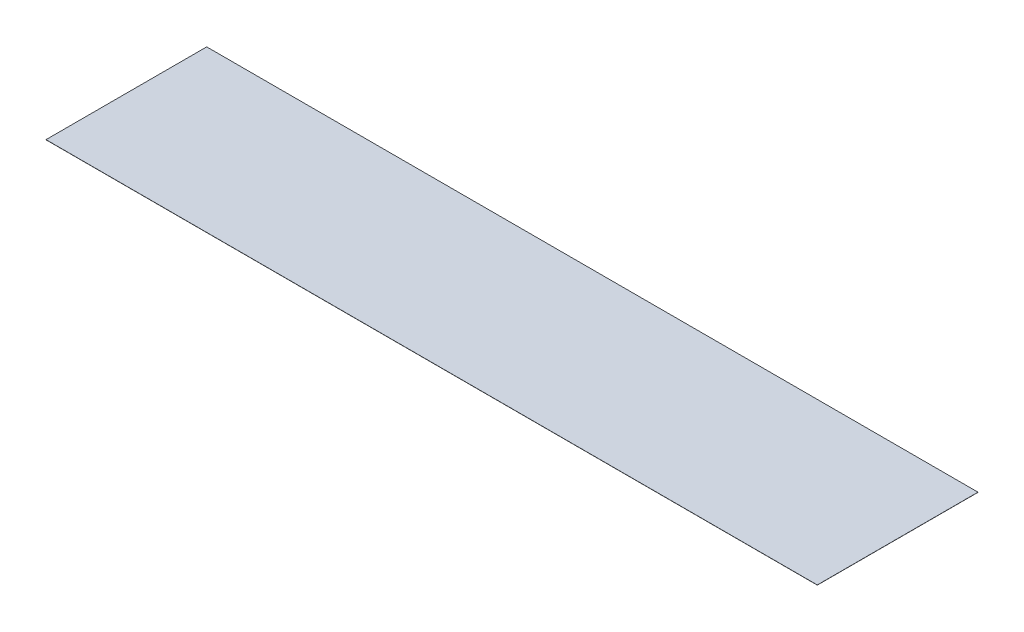
ISO-10303-21;
HEADER;
FILE_DESCRIPTION(('STEP AP214'),'2;1');
FILE_NAME('part.step','',(''),(''),'','','');
FILE_SCHEMA(('AUTOMOTIVE_DESIGN { 1 0 10303 214 1 1 1 1 }'));
ENDSEC;
DATA;
#1=APPLICATION_CONTEXT('core data for automotive mechanical design processes');
#2=APPLICATION_PROTOCOL_DEFINITION('international standard','automotive_design',2000,#1);
#3=PRODUCT_CONTEXT('',#1,'mechanical');
#4=PRODUCT('Part','Part','',(#3));
#5=PRODUCT_RELATED_PRODUCT_CATEGORY('part','',(#4));
#6=PRODUCT_DEFINITION_FORMATION('','',#4);
#7=PRODUCT_DEFINITION_CONTEXT('part definition',#1,'design');
#8=PRODUCT_DEFINITION('design','',#6,#7);
#9=PRODUCT_DEFINITION_SHAPE('','',#8);
#10=(LENGTH_UNIT() NAMED_UNIT(*) SI_UNIT(.MILLI.,.METRE.));
#11=(NAMED_UNIT(*) PLANE_ANGLE_UNIT() SI_UNIT($,.RADIAN.));
#12=(NAMED_UNIT(*) SI_UNIT($,.STERADIAN.) SOLID_ANGLE_UNIT());
#13=UNCERTAINTY_MEASURE_WITH_UNIT(LENGTH_MEASURE(1.E-05),#10,'distance_accuracy_value','');
#14=(GEOMETRIC_REPRESENTATION_CONTEXT(3) GLOBAL_UNCERTAINTY_ASSIGNED_CONTEXT((#13)) GLOBAL_UNIT_ASSIGNED_CONTEXT((#10,
#11,#12)) REPRESENTATION_CONTEXT('',''));
#15=CARTESIAN_POINT('',(0.,0.,0.));
#16=DIRECTION('',(0.,0.,1.));
#17=DIRECTION('',(1.,0.,0.));
#18=AXIS2_PLACEMENT_3D('',#15,#16,#17);
#19=CARTESIAN_POINT('',(-10972.8,4.7752,0.));
#20=DIRECTION('',(1.,0.,0.));
#21=DIRECTION('',(0.,0.,-1.));
#22=AXIS2_PLACEMENT_3D('',#19,#20,#21);
#23=PLANE('',#22);
#24=DIRECTION('',(0.,0.,1.));
#25=VECTOR('',#24,1.);
#26=CARTESIAN_POINT('',(-10972.8,0.,0.));
#27=LINE('',#26,#25);
#28=CARTESIAN_POINT('',(-10972.8,0.,-4572.));
#29=VERTEX_POINT('',#28);
#30=CARTESIAN_POINT('',(-10972.8,0.,0.));
#31=VERTEX_POINT('',#30);
#32=EDGE_CURVE('E100',#29,#31,#27,.T.);
#33=ORIENTED_EDGE('',*,*,#32,.T.);
#34=DIRECTION('',(0.,-1.,0.));
#35=VECTOR('',#34,1.);
#36=CARTESIAN_POINT('',(-10972.8,4.7752,0.));
#37=LINE('',#36,#35);
#38=CARTESIAN_POINT('',(-10972.8,4.7752,0.));
#39=VERTEX_POINT('',#38);
#40=EDGE_CURVE('E11',#39,#31,#37,.T.);
#41=ORIENTED_EDGE('',*,*,#40,.F.);
#42=DIRECTION('',(0.,0.,1.));
#43=VECTOR('',#42,1.);
#44=CARTESIAN_POINT('',(-10972.8,4.7752,0.));
#45=LINE('',#44,#43);
#46=CARTESIAN_POINT('',(-10972.8,4.7752,-4572.));
#47=VERTEX_POINT('',#46);
#48=EDGE_CURVE('E88',#47,#39,#45,.T.);
#49=ORIENTED_EDGE('',*,*,#48,.F.);
#50=DIRECTION('',(0.,-1.,0.));
#51=VECTOR('',#50,1.);
#52=CARTESIAN_POINT('',(-10972.8,4.7752,-4572.));
#53=LINE('',#52,#51);
#54=EDGE_CURVE('E96',#47,#29,#53,.T.);
#55=ORIENTED_EDGE('',*,*,#54,.T.);
#56=EDGE_LOOP('',(#33,#41,#49,#55));
#57=FACE_BOUND('',#56,.T.);
#58=ADVANCED_FACE('F37',(#57),#23,.F.);
#59=CARTESIAN_POINT('',(-10972.8,4.7752,0.));
#60=DIRECTION('',(0.,0.,-1.));
#61=DIRECTION('',(-1.,0.,0.));
#62=AXIS2_PLACEMENT_3D('',#59,#60,#61);
#63=PLANE('',#62);
#64=DIRECTION('',(1.,0.,0.));
#65=VECTOR('',#64,1.);
#66=CARTESIAN_POINT('',(-10972.8,0.,0.));
#67=LINE('',#66,#65);
#68=CARTESIAN_POINT('',(10972.8,0.,-4.03134131930522E-12));
#69=VERTEX_POINT('',#68);
#70=EDGE_CURVE('E92',#31,#69,#67,.T.);
#71=ORIENTED_EDGE('',*,*,#70,.T.);
#72=DIRECTION('',(0.,-1.,0.));
#73=VECTOR('',#72,1.);
#74=CARTESIAN_POINT('',(10972.8,4.7752,-4.03134131930522E-12));
#75=LINE('',#74,#73);
#76=CARTESIAN_POINT('',(10972.8,4.7752,-4.03134131930522E-12));
#77=VERTEX_POINT('',#76);
#78=EDGE_CURVE('E45',#77,#69,#75,.T.);
#79=ORIENTED_EDGE('',*,*,#78,.F.);
#80=DIRECTION('',(1.,0.,0.));
#81=VECTOR('',#80,1.);
#82=CARTESIAN_POINT('',(-10972.8,4.7752,0.));
#83=LINE('',#82,#81);
#84=EDGE_CURVE('E83',#39,#77,#83,.T.);
#85=ORIENTED_EDGE('',*,*,#84,.F.);
#86=ORIENTED_EDGE('',*,*,#40,.T.);
#87=EDGE_LOOP('',(#71,#79,#85,#86));
#88=FACE_BOUND('',#87,.T.);
#89=ADVANCED_FACE('F91',(#88),#63,.F.);
#90=CARTESIAN_POINT('',(10972.8,4.7752,-4.03134131930522E-12));
#91=DIRECTION('',(-1.,0.,0.));
#92=DIRECTION('',(0.,0.,1.));
#93=AXIS2_PLACEMENT_3D('',#90,#91,#92);
#94=PLANE('',#93);
#95=DIRECTION('',(0.,0.,-1.));
#96=VECTOR('',#95,1.);
#97=CARTESIAN_POINT('',(10972.8,0.,-4.03134131930522E-12));
#98=LINE('',#97,#96);
#99=CARTESIAN_POINT('',(10972.8,0.,-4572.));
#100=VERTEX_POINT('',#99);
#101=EDGE_CURVE('E70',#69,#100,#98,.T.);
#102=ORIENTED_EDGE('',*,*,#101,.T.);
#103=DIRECTION('',(0.,-1.,0.));
#104=VECTOR('',#103,1.);
#105=CARTESIAN_POINT('',(10972.8,4.7752,-4572.));
#106=LINE('',#105,#104);
#107=CARTESIAN_POINT('',(10972.8,4.7752,-4572.));
#108=VERTEX_POINT('',#107);
#109=EDGE_CURVE('E93',#108,#100,#106,.T.);
#110=ORIENTED_EDGE('',*,*,#109,.F.);
#111=DIRECTION('',(0.,0.,-1.));
#112=VECTOR('',#111,1.);
#113=CARTESIAN_POINT('',(10972.8,4.7752,-4.03134131930522E-12));
#114=LINE('',#113,#112);
#115=EDGE_CURVE('E86',#77,#108,#114,.T.);
#116=ORIENTED_EDGE('',*,*,#115,.F.);
#117=ORIENTED_EDGE('',*,*,#78,.T.);
#118=EDGE_LOOP('',(#102,#110,#116,#117));
#119=FACE_BOUND('',#118,.T.);
#120=ADVANCED_FACE('F94',(#119),#94,.F.);
#121=CARTESIAN_POINT('',(-10972.8,4.7752,-4572.));
#122=DIRECTION('',(0.,0.,1.));
#123=DIRECTION('',(1.,0.,0.));
#124=AXIS2_PLACEMENT_3D('',#121,#122,#123);
#125=PLANE('',#124);
#126=DIRECTION('',(-1.,0.,0.));
#127=VECTOR('',#126,1.);
#128=CARTESIAN_POINT('',(-10972.8,0.,-4572.));
#129=LINE('',#128,#127);
#130=EDGE_CURVE('E76',#100,#29,#129,.T.);
#131=ORIENTED_EDGE('',*,*,#130,.T.);
#132=ORIENTED_EDGE('',*,*,#54,.F.);
#133=DIRECTION('',(-1.,0.,0.));
#134=VECTOR('',#133,1.);
#135=CARTESIAN_POINT('',(-10972.8,4.7752,-4572.));
#136=LINE('',#135,#134);
#137=EDGE_CURVE('E53',#108,#47,#136,.T.);
#138=ORIENTED_EDGE('',*,*,#137,.F.);
#139=ORIENTED_EDGE('',*,*,#109,.T.);
#140=EDGE_LOOP('',(#131,#132,#138,#139));
#141=FACE_BOUND('',#140,.T.);
#142=ADVANCED_FACE('F107',(#141),#125,.F.);
#143=CARTESIAN_POINT('',(0.,4.7752,0.));
#144=DIRECTION('',(0.,-1.,0.));
#145=DIRECTION('',(0.,0.,-1.));
#146=AXIS2_PLACEMENT_3D('',#143,#144,#145);
#147=PLANE('',#146);
#148=ORIENTED_EDGE('',*,*,#48,.T.);
#149=ORIENTED_EDGE('',*,*,#84,.T.);
#150=ORIENTED_EDGE('',*,*,#115,.T.);
#151=ORIENTED_EDGE('',*,*,#137,.T.);
#152=EDGE_LOOP('',(#148,#149,#150,#151));
#153=FACE_BOUND('',#152,.T.);
#154=ADVANCED_FACE('F84',(#153),#147,.F.);
#155=CARTESIAN_POINT('',(0.,0.,0.));
#156=DIRECTION('',(0.,-1.,0.));
#157=DIRECTION('',(0.,0.,-1.));
#158=AXIS2_PLACEMENT_3D('',#155,#156,#157);
#159=PLANE('',#158);
#160=ORIENTED_EDGE('',*,*,#32,.F.);
#161=ORIENTED_EDGE('',*,*,#130,.F.);
#162=ORIENTED_EDGE('',*,*,#101,.F.);
#163=ORIENTED_EDGE('',*,*,#70,.F.);
#164=EDGE_LOOP('',(#160,#161,#162,#163));
#165=FACE_BOUND('',#164,.T.);
#166=ADVANCED_FACE('F110',(#165),#159,.T.);
#167=CLOSED_SHELL('',(#58,#89,#120,#142,#154,#166));
#168=MANIFOLD_SOLID_BREP('B2',#167);
#169=ADVANCED_BREP_SHAPE_REPRESENTATION('',(#18,#168),#14);
#170=SHAPE_DEFINITION_REPRESENTATION(#9,#169);
ENDSEC;
END-ISO-10303-21;
